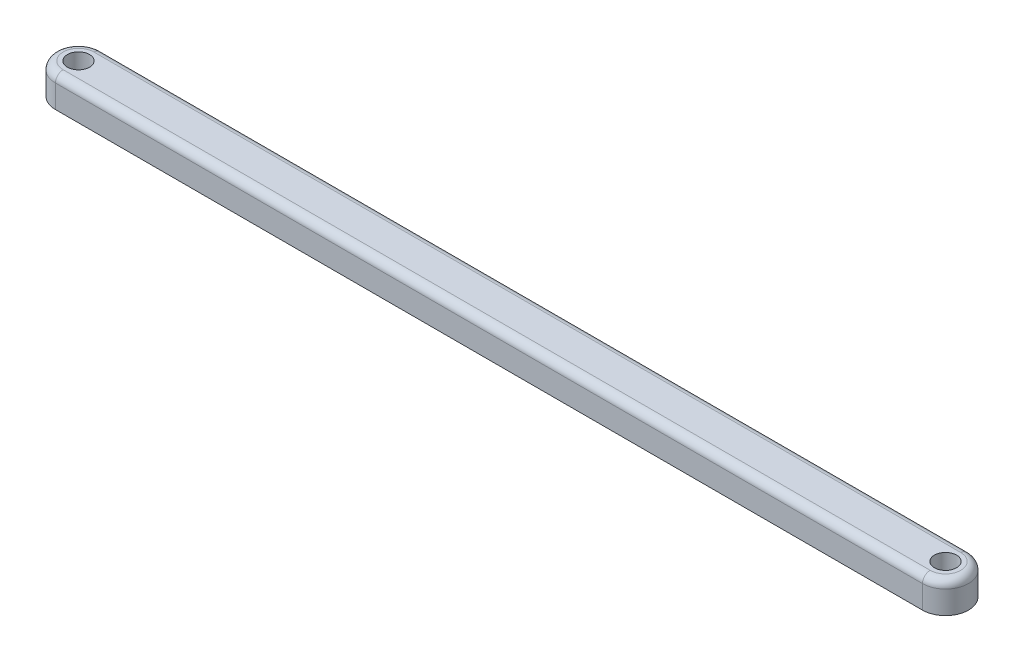
ISO-10303-21;
HEADER;
FILE_DESCRIPTION(('STEP AP214'),'2;1');
FILE_NAME('part.step','',(''),(''),'','','');
FILE_SCHEMA(('AUTOMOTIVE_DESIGN { 1 0 10303 214 1 1 1 1 }'));
ENDSEC;
DATA;
#1=APPLICATION_CONTEXT('core data for automotive mechanical design processes');
#2=APPLICATION_PROTOCOL_DEFINITION('international standard','automotive_design',2000,#1);
#3=PRODUCT_CONTEXT('',#1,'mechanical');
#4=PRODUCT('Part','Part','',(#3));
#5=PRODUCT_RELATED_PRODUCT_CATEGORY('part','',(#4));
#6=PRODUCT_DEFINITION_FORMATION('','',#4);
#7=PRODUCT_DEFINITION_CONTEXT('part definition',#1,'design');
#8=PRODUCT_DEFINITION('design','',#6,#7);
#9=PRODUCT_DEFINITION_SHAPE('','',#8);
#10=(LENGTH_UNIT() NAMED_UNIT(*) SI_UNIT(.MILLI.,.METRE.));
#11=(NAMED_UNIT(*) PLANE_ANGLE_UNIT() SI_UNIT($,.RADIAN.));
#12=(NAMED_UNIT(*) SI_UNIT($,.STERADIAN.) SOLID_ANGLE_UNIT());
#13=UNCERTAINTY_MEASURE_WITH_UNIT(LENGTH_MEASURE(1.E-05),#10,'distance_accuracy_value','');
#14=(GEOMETRIC_REPRESENTATION_CONTEXT(3) GLOBAL_UNCERTAINTY_ASSIGNED_CONTEXT((#13)) GLOBAL_UNIT_ASSIGNED_CONTEXT((#10,
#11,#12)) REPRESENTATION_CONTEXT('',''));
#15=CARTESIAN_POINT('',(0.,0.,0.));
#16=DIRECTION('',(0.,0.,1.));
#17=DIRECTION('',(1.,0.,0.));
#18=AXIS2_PLACEMENT_3D('',#15,#16,#17);
#19=CARTESIAN_POINT('',(0.,3.175,0.));
#20=DIRECTION('',(0.,-1.,0.));
#21=DIRECTION('',(0.,0.,-1.));
#22=AXIS2_PLACEMENT_3D('',#19,#20,#21);
#23=CYLINDRICAL_SURFACE('',#22,4.7625);
#24=DIRECTION('',(0.,-1.,0.));
#25=VECTOR('',#24,1.);
#26=CARTESIAN_POINT('',(0.,3.175,4.7625));
#27=LINE('',#26,#25);
#28=CARTESIAN_POINT('',(0.,1.5875,4.7625));
#29=VERTEX_POINT('',#28);
#30=CARTESIAN_POINT('',(0.,-3.175,4.7625));
#31=VERTEX_POINT('',#30);
#32=EDGE_CURVE('E93',#29,#31,#27,.T.);
#33=ORIENTED_EDGE('',*,*,#32,.F.);
#34=CARTESIAN_POINT('',(0.,1.5875,0.));
#35=DIRECTION('',(0.,1.,0.));
#36=DIRECTION('',(0.,0.,1.));
#37=AXIS2_PLACEMENT_3D('',#34,#35,#36);
#38=CIRCLE('',#37,4.7625);
#39=CARTESIAN_POINT('',(0.,1.5875,-4.7625));
#40=VERTEX_POINT('',#39);
#41=EDGE_CURVE('E50',#29,#40,#38,.F.);
#42=ORIENTED_EDGE('',*,*,#41,.T.);
#43=DIRECTION('',(0.,-1.,0.));
#44=VECTOR('',#43,1.);
#45=CARTESIAN_POINT('',(0.,3.175,-4.7625));
#46=LINE('',#45,#44);
#47=CARTESIAN_POINT('',(0.,-3.175,-4.7625));
#48=VERTEX_POINT('',#47);
#49=EDGE_CURVE('E111',#40,#48,#46,.T.);
#50=ORIENTED_EDGE('',*,*,#49,.T.);
#51=CARTESIAN_POINT('',(0.,-3.175,0.));
#52=DIRECTION('',(0.,1.,0.));
#53=DIRECTION('',(0.,0.,1.));
#54=AXIS2_PLACEMENT_3D('',#51,#52,#53);
#55=CIRCLE('',#54,4.7625);
#56=EDGE_CURVE('E106',#48,#31,#55,.T.);
#57=ORIENTED_EDGE('',*,*,#56,.T.);
#58=EDGE_LOOP('',(#33,#42,#50,#57));
#59=FACE_BOUND('',#58,.T.);
#60=ADVANCED_FACE('F41',(#59),#23,.T.);
#61=CARTESIAN_POINT('',(0.,3.175,4.7625));
#62=DIRECTION('',(0.,0.,-1.));
#63=DIRECTION('',(-1.,0.,0.));
#64=AXIS2_PLACEMENT_3D('',#61,#62,#63);
#65=PLANE('',#64);
#66=DIRECTION('',(0.,-1.,0.));
#67=VECTOR('',#66,1.);
#68=CARTESIAN_POINT('',(179.3875,3.175,4.7625));
#69=LINE('',#68,#67);
#70=CARTESIAN_POINT('',(179.3875,1.5875,4.7625));
#71=VERTEX_POINT('',#70);
#72=CARTESIAN_POINT('',(179.3875,-3.175,4.7625));
#73=VERTEX_POINT('',#72);
#74=EDGE_CURVE('E100',#71,#73,#69,.T.);
#75=ORIENTED_EDGE('',*,*,#74,.F.);
#76=DIRECTION('',(1.,0.,0.));
#77=VECTOR('',#76,1.);
#78=CARTESIAN_POINT('',(0.,1.5875,4.7625));
#79=LINE('',#78,#77);
#80=EDGE_CURVE('E65',#71,#29,#79,.F.);
#81=ORIENTED_EDGE('',*,*,#80,.T.);
#82=ORIENTED_EDGE('',*,*,#32,.T.);
#83=DIRECTION('',(1.,0.,0.));
#84=VECTOR('',#83,1.);
#85=CARTESIAN_POINT('',(0.,-3.175,4.7625));
#86=LINE('',#85,#84);
#87=EDGE_CURVE('E96',#31,#73,#86,.T.);
#88=ORIENTED_EDGE('',*,*,#87,.T.);
#89=EDGE_LOOP('',(#75,#81,#82,#88));
#90=FACE_BOUND('',#89,.T.);
#91=ADVANCED_FACE('F95',(#90),#65,.F.);
#92=CARTESIAN_POINT('',(179.3875,3.175,0.));
#93=DIRECTION('',(0.,-1.,0.));
#94=DIRECTION('',(0.,0.,-1.));
#95=AXIS2_PLACEMENT_3D('',#92,#93,#94);
#96=CYLINDRICAL_SURFACE('',#95,4.7625);
#97=DIRECTION('',(0.,-1.,0.));
#98=VECTOR('',#97,1.);
#99=CARTESIAN_POINT('',(179.3875,3.175,-4.7625));
#100=LINE('',#99,#98);
#101=CARTESIAN_POINT('',(179.3875,1.5875,-4.7625));
#102=VERTEX_POINT('',#101);
#103=CARTESIAN_POINT('',(179.3875,-3.175,-4.7625));
#104=VERTEX_POINT('',#103);
#105=EDGE_CURVE('E126',#102,#104,#100,.T.);
#106=ORIENTED_EDGE('',*,*,#105,.F.);
#107=CARTESIAN_POINT('',(179.3875,1.5875,0.));
#108=DIRECTION('',(0.,1.,0.));
#109=DIRECTION('',(0.,0.,1.));
#110=AXIS2_PLACEMENT_3D('',#107,#108,#109);
#111=CIRCLE('',#110,4.7625);
#112=EDGE_CURVE('E139',#102,#71,#111,.F.);
#113=ORIENTED_EDGE('',*,*,#112,.T.);
#114=ORIENTED_EDGE('',*,*,#74,.T.);
#115=CARTESIAN_POINT('',(179.3875,-3.175,0.));
#116=DIRECTION('',(0.,1.,0.));
#117=DIRECTION('',(0.,0.,1.));
#118=AXIS2_PLACEMENT_3D('',#115,#116,#117);
#119=CIRCLE('',#118,4.7625);
#120=EDGE_CURVE('E108',#73,#104,#119,.T.);
#121=ORIENTED_EDGE('',*,*,#120,.T.);
#122=EDGE_LOOP('',(#106,#113,#114,#121));
#123=FACE_BOUND('',#122,.T.);
#124=ADVANCED_FACE('F185',(#123),#96,.T.);
#125=CARTESIAN_POINT('',(0.,3.175,-4.7625));
#126=DIRECTION('',(0.,0.,1.));
#127=DIRECTION('',(1.,0.,0.));
#128=AXIS2_PLACEMENT_3D('',#125,#126,#127);
#129=PLANE('',#128);
#130=ORIENTED_EDGE('',*,*,#49,.F.);
#131=DIRECTION('',(-1.,0.,0.));
#132=VECTOR('',#131,1.);
#133=CARTESIAN_POINT('',(179.3875,1.5875,-4.7625));
#134=LINE('',#133,#132);
#135=EDGE_CURVE('E11',#40,#102,#134,.F.);
#136=ORIENTED_EDGE('',*,*,#135,.T.);
#137=ORIENTED_EDGE('',*,*,#105,.T.);
#138=DIRECTION('',(-1.,0.,0.));
#139=VECTOR('',#138,1.);
#140=CARTESIAN_POINT('',(0.,-3.175,-4.7625));
#141=LINE('',#140,#139);
#142=EDGE_CURVE('E123',#104,#48,#141,.T.);
#143=ORIENTED_EDGE('',*,*,#142,.T.);
#144=EDGE_LOOP('',(#130,#136,#137,#143));
#145=FACE_BOUND('',#144,.T.);
#146=ADVANCED_FACE('F174',(#145),#129,.F.);
#147=CARTESIAN_POINT('',(0.,3.175,0.));
#148=DIRECTION('',(0.,1.,0.));
#149=DIRECTION('',(0.,0.,1.));
#150=AXIS2_PLACEMENT_3D('',#147,#148,#149);
#151=PLANE('',#150);
#152=DIRECTION('',(1.,0.,0.));
#153=VECTOR('',#152,1.);
#154=CARTESIAN_POINT('',(179.3875,3.175,3.175));
#155=LINE('',#154,#153);
#156=CARTESIAN_POINT('',(0.,3.175,3.175));
#157=VERTEX_POINT('',#156);
#158=CARTESIAN_POINT('',(179.3875,3.175,3.175));
#159=VERTEX_POINT('',#158);
#160=EDGE_CURVE('E133',#157,#159,#155,.T.);
#161=ORIENTED_EDGE('',*,*,#160,.T.);
#162=CARTESIAN_POINT('',(179.3875,3.175,0.));
#163=DIRECTION('',(0.,1.,0.));
#164=DIRECTION('',(0.,0.,1.));
#165=AXIS2_PLACEMENT_3D('',#162,#163,#164);
#166=CIRCLE('',#165,3.175);
#167=CARTESIAN_POINT('',(179.3875,3.175,-3.175));
#168=VERTEX_POINT('',#167);
#169=EDGE_CURVE('E136',#159,#168,#166,.T.);
#170=ORIENTED_EDGE('',*,*,#169,.T.);
#171=DIRECTION('',(-1.,0.,0.));
#172=VECTOR('',#171,1.);
#173=CARTESIAN_POINT('',(0.,3.175,-3.175));
#174=LINE('',#173,#172);
#175=CARTESIAN_POINT('',(0.,3.175,-3.175));
#176=VERTEX_POINT('',#175);
#177=EDGE_CURVE('E99',#168,#176,#174,.T.);
#178=ORIENTED_EDGE('',*,*,#177,.T.);
#179=CARTESIAN_POINT('',(0.,3.175,0.));
#180=DIRECTION('',(0.,1.,0.));
#181=DIRECTION('',(0.,0.,1.));
#182=AXIS2_PLACEMENT_3D('',#179,#180,#181);
#183=CIRCLE('',#182,3.175);
#184=EDGE_CURVE('E131',#176,#157,#183,.T.);
#185=ORIENTED_EDGE('',*,*,#184,.T.);
#186=EDGE_LOOP('',(#161,#170,#178,#185));
#187=FACE_BOUND('',#186,.T.);
#188=CARTESIAN_POINT('',(0.,3.175,0.));
#189=DIRECTION('',(0.,1.,0.));
#190=DIRECTION('',(0.,0.,1.));
#191=AXIS2_PLACEMENT_3D('',#188,#189,#190);
#192=CIRCLE('',#191,2.286);
#193=CARTESIAN_POINT('',(0.,3.175,2.286));
#194=VERTEX_POINT('',#193);
#195=EDGE_CURVE('E116',#194,#194,#192,.T.);
#196=ORIENTED_EDGE('',*,*,#195,.F.);
#197=EDGE_LOOP('',(#196));
#198=FACE_BOUND('',#197,.T.);
#199=CARTESIAN_POINT('',(179.3875,3.175,0.));
#200=DIRECTION('',(0.,1.,0.));
#201=DIRECTION('',(0.,0.,1.));
#202=AXIS2_PLACEMENT_3D('',#199,#200,#201);
#203=CIRCLE('',#202,2.28600000000001);
#204=CARTESIAN_POINT('',(179.3875,3.175,2.28600000000001));
#205=VERTEX_POINT('',#204);
#206=EDGE_CURVE('E159',#205,#205,#203,.T.);
#207=ORIENTED_EDGE('',*,*,#206,.F.);
#208=EDGE_LOOP('',(#207));
#209=FACE_BOUND('',#208,.T.);
#210=ADVANCED_FACE('F171',(#187,#198,#209),#151,.T.);
#211=CARTESIAN_POINT('',(0.,-3.175,0.));
#212=DIRECTION('',(0.,1.,0.));
#213=DIRECTION('',(0.,0.,1.));
#214=AXIS2_PLACEMENT_3D('',#211,#212,#213);
#215=PLANE('',#214);
#216=CARTESIAN_POINT('',(0.,-3.175,0.));
#217=DIRECTION('',(0.,1.,0.));
#218=DIRECTION('',(0.,0.,1.));
#219=AXIS2_PLACEMENT_3D('',#216,#217,#218);
#220=CIRCLE('',#219,2.286);
#221=CARTESIAN_POINT('',(0.,-3.175,2.286));
#222=VERTEX_POINT('',#221);
#223=EDGE_CURVE('E113',#222,#222,#220,.T.);
#224=ORIENTED_EDGE('',*,*,#223,.T.);
#225=EDGE_LOOP('',(#224));
#226=FACE_BOUND('',#225,.T.);
#227=CARTESIAN_POINT('',(179.3875,-3.175,0.));
#228=DIRECTION('',(0.,1.,0.));
#229=DIRECTION('',(0.,0.,1.));
#230=AXIS2_PLACEMENT_3D('',#227,#228,#229);
#231=CIRCLE('',#230,2.28600000000001);
#232=CARTESIAN_POINT('',(179.3875,-3.175,2.28600000000001));
#233=VERTEX_POINT('',#232);
#234=EDGE_CURVE('E119',#233,#233,#231,.T.);
#235=ORIENTED_EDGE('',*,*,#234,.T.);
#236=EDGE_LOOP('',(#235));
#237=FACE_BOUND('',#236,.T.);
#238=ORIENTED_EDGE('',*,*,#56,.F.);
#239=ORIENTED_EDGE('',*,*,#142,.F.);
#240=ORIENTED_EDGE('',*,*,#120,.F.);
#241=ORIENTED_EDGE('',*,*,#87,.F.);
#242=EDGE_LOOP('',(#238,#239,#240,#241));
#243=FACE_BOUND('',#242,.T.);
#244=ADVANCED_FACE('F104',(#226,#237,#243),#215,.F.);
#245=CARTESIAN_POINT('',(179.3875,-3.175,0.));
#246=DIRECTION('',(0.,1.,0.));
#247=DIRECTION('',(0.,0.,1.));
#248=AXIS2_PLACEMENT_3D('',#245,#246,#247);
#249=CYLINDRICAL_SURFACE('',#248,2.28600000000001);
#250=ORIENTED_EDGE('',*,*,#234,.F.);
#251=EDGE_LOOP('',(#250));
#252=FACE_BOUND('',#251,.T.);
#253=ORIENTED_EDGE('',*,*,#206,.T.);
#254=EDGE_LOOP('',(#253));
#255=FACE_BOUND('',#254,.T.);
#256=ADVANCED_FACE('F182',(#252,#255),#249,.F.);
#257=CARTESIAN_POINT('',(0.,-3.175,0.));
#258=DIRECTION('',(0.,1.,0.));
#259=DIRECTION('',(0.,0.,1.));
#260=AXIS2_PLACEMENT_3D('',#257,#258,#259);
#261=CYLINDRICAL_SURFACE('',#260,2.286);
#262=ORIENTED_EDGE('',*,*,#223,.F.);
#263=EDGE_LOOP('',(#262));
#264=FACE_BOUND('',#263,.T.);
#265=ORIENTED_EDGE('',*,*,#195,.T.);
#266=EDGE_LOOP('',(#265));
#267=FACE_BOUND('',#266,.T.);
#268=ADVANCED_FACE('F169',(#264,#267),#261,.F.);
#269=CARTESIAN_POINT('',(0.,1.5875,0.));
#270=DIRECTION('',(0.,1.,0.));
#271=DIRECTION('',(0.,0.,1.));
#272=AXIS2_PLACEMENT_3D('',#269,#270,#271);
#273=TOROIDAL_SURFACE('',#272,3.175,1.5875);
#274=CARTESIAN_POINT('',(0.,1.5875,-3.175));
#275=DIRECTION('',(1.,0.,0.));
#276=DIRECTION('',(0.,0.,-1.));
#277=AXIS2_PLACEMENT_3D('',#274,#275,#276);
#278=CIRCLE('',#277,1.5875);
#279=EDGE_CURVE('E148',#40,#176,#278,.T.);
#280=ORIENTED_EDGE('',*,*,#279,.F.);
#281=ORIENTED_EDGE('',*,*,#41,.F.);
#282=CARTESIAN_POINT('',(0.,1.5875,3.175));
#283=DIRECTION('',(1.,0.,0.));
#284=DIRECTION('',(0.,0.,-1.));
#285=AXIS2_PLACEMENT_3D('',#282,#283,#284);
#286=CIRCLE('',#285,1.5875);
#287=EDGE_CURVE('E45',#157,#29,#286,.T.);
#288=ORIENTED_EDGE('',*,*,#287,.F.);
#289=ORIENTED_EDGE('',*,*,#184,.F.);
#290=EDGE_LOOP('',(#280,#281,#288,#289));
#291=FACE_BOUND('',#290,.T.);
#292=ADVANCED_FACE('F43',(#291),#273,.T.);
#293=CARTESIAN_POINT('',(0.,1.5875,3.175));
#294=DIRECTION('',(-1.,0.,0.));
#295=DIRECTION('',(0.,0.,1.));
#296=AXIS2_PLACEMENT_3D('',#293,#294,#295);
#297=CYLINDRICAL_SURFACE('',#296,1.5875);
#298=ORIENTED_EDGE('',*,*,#287,.T.);
#299=ORIENTED_EDGE('',*,*,#80,.F.);
#300=CARTESIAN_POINT('',(179.3875,1.5875,3.175));
#301=DIRECTION('',(1.,0.,0.));
#302=DIRECTION('',(0.,0.,-1.));
#303=AXIS2_PLACEMENT_3D('',#300,#301,#302);
#304=CIRCLE('',#303,1.5875);
#305=EDGE_CURVE('E147',#159,#71,#304,.T.);
#306=ORIENTED_EDGE('',*,*,#305,.F.);
#307=ORIENTED_EDGE('',*,*,#160,.F.);
#308=EDGE_LOOP('',(#298,#299,#306,#307));
#309=FACE_BOUND('',#308,.T.);
#310=ADVANCED_FACE('F204',(#309),#297,.T.);
#311=CARTESIAN_POINT('',(0.,1.5875,-3.175));
#312=DIRECTION('',(1.,0.,0.));
#313=DIRECTION('',(0.,0.,-1.));
#314=AXIS2_PLACEMENT_3D('',#311,#312,#313);
#315=CYLINDRICAL_SURFACE('',#314,1.5875);
#316=ORIENTED_EDGE('',*,*,#279,.T.);
#317=ORIENTED_EDGE('',*,*,#177,.F.);
#318=CARTESIAN_POINT('',(179.3875,1.5875,-3.175));
#319=DIRECTION('',(1.,0.,0.));
#320=DIRECTION('',(0.,0.,-1.));
#321=AXIS2_PLACEMENT_3D('',#318,#319,#320);
#322=CIRCLE('',#321,1.5875);
#323=EDGE_CURVE('E145',#102,#168,#322,.T.);
#324=ORIENTED_EDGE('',*,*,#323,.F.);
#325=ORIENTED_EDGE('',*,*,#135,.F.);
#326=EDGE_LOOP('',(#316,#317,#324,#325));
#327=FACE_BOUND('',#326,.T.);
#328=ADVANCED_FACE('F201',(#327),#315,.T.);
#329=CARTESIAN_POINT('',(179.3875,1.5875,0.));
#330=DIRECTION('',(0.,1.,0.));
#331=DIRECTION('',(0.,0.,1.));
#332=AXIS2_PLACEMENT_3D('',#329,#330,#331);
#333=TOROIDAL_SURFACE('',#332,3.175,1.5875);
#334=ORIENTED_EDGE('',*,*,#305,.T.);
#335=ORIENTED_EDGE('',*,*,#112,.F.);
#336=ORIENTED_EDGE('',*,*,#323,.T.);
#337=ORIENTED_EDGE('',*,*,#169,.F.);
#338=EDGE_LOOP('',(#334,#335,#336,#337));
#339=FACE_BOUND('',#338,.T.);
#340=ADVANCED_FACE('F198',(#339),#333,.T.);
#341=CLOSED_SHELL('',(#60,#91,#124,#146,#210,#244,#256,#268,#292,#310,#328,#340));
#342=MANIFOLD_SOLID_BREP('B2',#341);
#343=ADVANCED_BREP_SHAPE_REPRESENTATION('',(#18,#342),#14);
#344=SHAPE_DEFINITION_REPRESENTATION(#9,#343);
ENDSEC;
END-ISO-10303-21;
